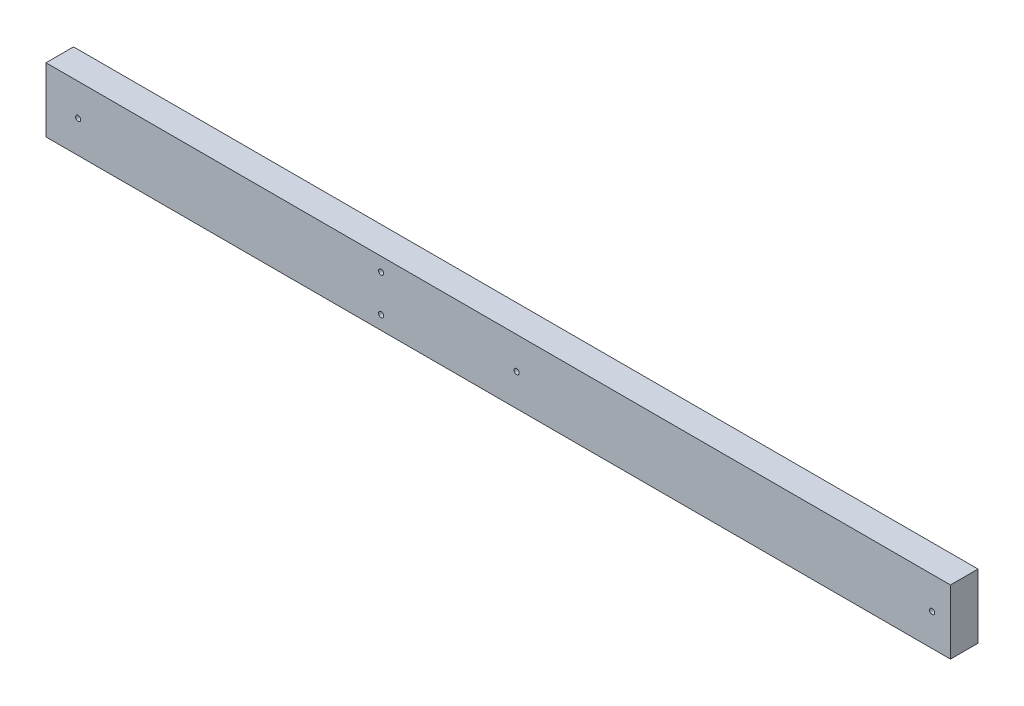
ISO-10303-21;
HEADER;
FILE_DESCRIPTION(('STEP AP214'),'2;1');
FILE_NAME('part.step','',(''),(''),'','','');
FILE_SCHEMA(('AUTOMOTIVE_DESIGN { 1 0 10303 214 1 1 1 1 }'));
ENDSEC;
DATA;
#1=APPLICATION_CONTEXT('core data for automotive mechanical design processes');
#2=APPLICATION_PROTOCOL_DEFINITION('international standard','automotive_design',2000,#1);
#3=PRODUCT_CONTEXT('',#1,'mechanical');
#4=PRODUCT('Part','Part','',(#3));
#5=PRODUCT_RELATED_PRODUCT_CATEGORY('part','',(#4));
#6=PRODUCT_DEFINITION_FORMATION('','',#4);
#7=PRODUCT_DEFINITION_CONTEXT('part definition',#1,'design');
#8=PRODUCT_DEFINITION('design','',#6,#7);
#9=PRODUCT_DEFINITION_SHAPE('','',#8);
#10=(LENGTH_UNIT() NAMED_UNIT(*) SI_UNIT(.MILLI.,.METRE.));
#11=(NAMED_UNIT(*) PLANE_ANGLE_UNIT() SI_UNIT($,.RADIAN.));
#12=(NAMED_UNIT(*) SI_UNIT($,.STERADIAN.) SOLID_ANGLE_UNIT());
#13=UNCERTAINTY_MEASURE_WITH_UNIT(LENGTH_MEASURE(1.E-05),#10,'distance_accuracy_value','');
#14=(GEOMETRIC_REPRESENTATION_CONTEXT(3) GLOBAL_UNCERTAINTY_ASSIGNED_CONTEXT((#13)) GLOBAL_UNIT_ASSIGNED_CONTEXT((#10,
#11,#12)) REPRESENTATION_CONTEXT('',''));
#15=CARTESIAN_POINT('',(0.,0.,0.));
#16=DIRECTION('',(0.,0.,1.));
#17=DIRECTION('',(1.,0.,0.));
#18=AXIS2_PLACEMENT_3D('',#15,#16,#17);
#19=CARTESIAN_POINT('',(1250.95,0.,0.));
#20=DIRECTION('',(0.,0.,-1.));
#21=DIRECTION('',(0.,1.,0.));
#22=AXIS2_PLACEMENT_3D('',#19,#20,#21);
#23=PLANE('',#22);
#24=CARTESIAN_POINT('',(44.45,44.45,0.));
#25=DIRECTION('',(0.,0.,1.));
#26=DIRECTION('',(1.,0.,0.));
#27=AXIS2_PLACEMENT_3D('',#24,#25,#26);
#28=CIRCLE('',#27,3.571875);
#29=CARTESIAN_POINT('',(48.021875,44.45,0.));
#30=VERTEX_POINT('',#29);
#31=EDGE_CURVE('E133',#30,#30,#28,.T.);
#32=ORIENTED_EDGE('',*,*,#31,.F.);
#33=EDGE_LOOP('',(#32));
#34=FACE_BOUND('',#33,.T.);
#35=CARTESIAN_POINT('',(1225.55,44.45,0.));
#36=DIRECTION('',(0.,0.,1.));
#37=DIRECTION('',(1.,0.,0.));
#38=AXIS2_PLACEMENT_3D('',#35,#36,#37);
#39=CIRCLE('',#38,3.57187499999998);
#40=CARTESIAN_POINT('',(1229.121875,44.45,0.));
#41=VERTEX_POINT('',#40);
#42=EDGE_CURVE('E127',#41,#41,#39,.T.);
#43=ORIENTED_EDGE('',*,*,#42,.F.);
#44=EDGE_LOOP('',(#43));
#45=FACE_BOUND('',#44,.T.);
#46=CARTESIAN_POINT('',(650.875,44.45,0.));
#47=DIRECTION('',(0.,0.,1.));
#48=DIRECTION('',(1.,0.,0.));
#49=AXIS2_PLACEMENT_3D('',#46,#47,#48);
#50=CIRCLE('',#49,3.57187499999998);
#51=CARTESIAN_POINT('',(654.446875,44.45,0.));
#52=VERTEX_POINT('',#51);
#53=EDGE_CURVE('E121',#52,#52,#50,.T.);
#54=ORIENTED_EDGE('',*,*,#53,.F.);
#55=EDGE_LOOP('',(#54));
#56=FACE_BOUND('',#55,.T.);
#57=CARTESIAN_POINT('',(463.55,19.05,0.));
#58=DIRECTION('',(0.,0.,1.));
#59=DIRECTION('',(1.,0.,0.));
#60=AXIS2_PLACEMENT_3D('',#57,#58,#59);
#61=CIRCLE('',#60,3.57187499999998);
#62=CARTESIAN_POINT('',(467.121875,19.05,0.));
#63=VERTEX_POINT('',#62);
#64=EDGE_CURVE('E115',#63,#63,#61,.T.);
#65=ORIENTED_EDGE('',*,*,#64,.F.);
#66=EDGE_LOOP('',(#65));
#67=FACE_BOUND('',#66,.T.);
#68=CARTESIAN_POINT('',(463.55,69.85,0.));
#69=DIRECTION('',(0.,0.,1.));
#70=DIRECTION('',(1.,0.,0.));
#71=AXIS2_PLACEMENT_3D('',#68,#69,#70);
#72=CIRCLE('',#71,3.57187499999998);
#73=CARTESIAN_POINT('',(467.121875,69.85,0.));
#74=VERTEX_POINT('',#73);
#75=EDGE_CURVE('E109',#74,#74,#72,.T.);
#76=ORIENTED_EDGE('',*,*,#75,.F.);
#77=EDGE_LOOP('',(#76));
#78=FACE_BOUND('',#77,.T.);
#79=DIRECTION('',(0.,-1.,0.));
#80=VECTOR('',#79,1.);
#81=CARTESIAN_POINT('',(0.,0.,0.));
#82=LINE('',#81,#80);
#83=CARTESIAN_POINT('',(0.,88.9,0.));
#84=VERTEX_POINT('',#83);
#85=CARTESIAN_POINT('',(0.,0.,0.));
#86=VERTEX_POINT('',#85);
#87=EDGE_CURVE('E95',#84,#86,#82,.T.);
#88=ORIENTED_EDGE('',*,*,#87,.T.);
#89=DIRECTION('',(-1.,0.,0.));
#90=VECTOR('',#89,1.);
#91=CARTESIAN_POINT('',(1250.95,0.,0.));
#92=LINE('',#91,#90);
#93=CARTESIAN_POINT('',(1250.95,0.,0.));
#94=VERTEX_POINT('',#93);
#95=EDGE_CURVE('E11',#94,#86,#92,.T.);
#96=ORIENTED_EDGE('',*,*,#95,.F.);
#97=DIRECTION('',(0.,-1.,0.));
#98=VECTOR('',#97,1.);
#99=CARTESIAN_POINT('',(1250.95,0.,0.));
#100=LINE('',#99,#98);
#101=CARTESIAN_POINT('',(1250.95,88.9,0.));
#102=VERTEX_POINT('',#101);
#103=EDGE_CURVE('E83',#102,#94,#100,.T.);
#104=ORIENTED_EDGE('',*,*,#103,.F.);
#105=DIRECTION('',(-1.,0.,0.));
#106=VECTOR('',#105,1.);
#107=CARTESIAN_POINT('',(1250.95,88.9,0.));
#108=LINE('',#107,#106);
#109=EDGE_CURVE('E91',#102,#84,#108,.T.);
#110=ORIENTED_EDGE('',*,*,#109,.T.);
#111=EDGE_LOOP('',(#88,#96,#104,#110));
#112=FACE_BOUND('',#111,.T.);
#113=ADVANCED_FACE('F32',(#34,#45,#56,#67,#78,#112),#23,.F.);
#114=CARTESIAN_POINT('',(1250.95,0.,0.));
#115=DIRECTION('',(0.,1.,0.));
#116=DIRECTION('',(0.,0.,1.));
#117=AXIS2_PLACEMENT_3D('',#114,#115,#116);
#118=PLANE('',#117);
#119=DIRECTION('',(0.,0.,-1.));
#120=VECTOR('',#119,1.);
#121=CARTESIAN_POINT('',(0.,0.,0.));
#122=LINE('',#121,#120);
#123=CARTESIAN_POINT('',(0.,0.,-38.1));
#124=VERTEX_POINT('',#123);
#125=EDGE_CURVE('E87',#86,#124,#122,.T.);
#126=ORIENTED_EDGE('',*,*,#125,.T.);
#127=DIRECTION('',(-1.,0.,0.));
#128=VECTOR('',#127,1.);
#129=CARTESIAN_POINT('',(1250.95,0.,-38.1));
#130=LINE('',#129,#128);
#131=CARTESIAN_POINT('',(1250.95,0.,-38.1));
#132=VERTEX_POINT('',#131);
#133=EDGE_CURVE('E40',#132,#124,#130,.T.);
#134=ORIENTED_EDGE('',*,*,#133,.F.);
#135=DIRECTION('',(0.,0.,-1.));
#136=VECTOR('',#135,1.);
#137=CARTESIAN_POINT('',(1250.95,0.,0.));
#138=LINE('',#137,#136);
#139=EDGE_CURVE('E78',#94,#132,#138,.T.);
#140=ORIENTED_EDGE('',*,*,#139,.F.);
#141=ORIENTED_EDGE('',*,*,#95,.T.);
#142=EDGE_LOOP('',(#126,#134,#140,#141));
#143=FACE_BOUND('',#142,.T.);
#144=ADVANCED_FACE('F86',(#143),#118,.F.);
#145=CARTESIAN_POINT('',(1250.95,0.,-38.1));
#146=DIRECTION('',(0.,0.,1.));
#147=DIRECTION('',(0.,-1.,0.));
#148=AXIS2_PLACEMENT_3D('',#145,#146,#147);
#149=PLANE('',#148);
#150=CARTESIAN_POINT('',(44.45,44.45,-38.1));
#151=DIRECTION('',(0.,0.,1.));
#152=DIRECTION('',(1.,0.,0.));
#153=AXIS2_PLACEMENT_3D('',#150,#151,#152);
#154=CIRCLE('',#153,3.571875);
#155=CARTESIAN_POINT('',(48.021875,44.45,-38.1));
#156=VERTEX_POINT('',#155);
#157=EDGE_CURVE('E98',#156,#156,#154,.T.);
#158=ORIENTED_EDGE('',*,*,#157,.T.);
#159=EDGE_LOOP('',(#158));
#160=FACE_BOUND('',#159,.T.);
#161=CARTESIAN_POINT('',(1225.55,44.45,-38.1));
#162=DIRECTION('',(0.,0.,1.));
#163=DIRECTION('',(1.,0.,0.));
#164=AXIS2_PLACEMENT_3D('',#161,#162,#163);
#165=CIRCLE('',#164,3.57187499999998);
#166=CARTESIAN_POINT('',(1229.121875,44.45,-38.1));
#167=VERTEX_POINT('',#166);
#168=EDGE_CURVE('E130',#167,#167,#165,.T.);
#169=ORIENTED_EDGE('',*,*,#168,.T.);
#170=EDGE_LOOP('',(#169));
#171=FACE_BOUND('',#170,.T.);
#172=CARTESIAN_POINT('',(650.875,44.45,-38.1));
#173=DIRECTION('',(0.,0.,1.));
#174=DIRECTION('',(1.,0.,0.));
#175=AXIS2_PLACEMENT_3D('',#172,#173,#174);
#176=CIRCLE('',#175,3.57187499999998);
#177=CARTESIAN_POINT('',(654.446875,44.45,-38.1));
#178=VERTEX_POINT('',#177);
#179=EDGE_CURVE('E124',#178,#178,#176,.T.);
#180=ORIENTED_EDGE('',*,*,#179,.T.);
#181=EDGE_LOOP('',(#180));
#182=FACE_BOUND('',#181,.T.);
#183=CARTESIAN_POINT('',(463.55,19.05,-38.1));
#184=DIRECTION('',(0.,0.,1.));
#185=DIRECTION('',(1.,0.,0.));
#186=AXIS2_PLACEMENT_3D('',#183,#184,#185);
#187=CIRCLE('',#186,3.57187499999998);
#188=CARTESIAN_POINT('',(467.121875,19.05,-38.1));
#189=VERTEX_POINT('',#188);
#190=EDGE_CURVE('E118',#189,#189,#187,.T.);
#191=ORIENTED_EDGE('',*,*,#190,.T.);
#192=EDGE_LOOP('',(#191));
#193=FACE_BOUND('',#192,.T.);
#194=CARTESIAN_POINT('',(463.55,69.85,-38.1));
#195=DIRECTION('',(0.,0.,1.));
#196=DIRECTION('',(1.,0.,0.));
#197=AXIS2_PLACEMENT_3D('',#194,#195,#196);
#198=CIRCLE('',#197,3.57187499999998);
#199=CARTESIAN_POINT('',(467.121875,69.85,-38.1));
#200=VERTEX_POINT('',#199);
#201=EDGE_CURVE('E112',#200,#200,#198,.T.);
#202=ORIENTED_EDGE('',*,*,#201,.T.);
#203=EDGE_LOOP('',(#202));
#204=FACE_BOUND('',#203,.T.);
#205=DIRECTION('',(0.,1.,0.));
#206=VECTOR('',#205,1.);
#207=CARTESIAN_POINT('',(0.,0.,-38.1));
#208=LINE('',#207,#206);
#209=CARTESIAN_POINT('',(0.,88.9,-38.1));
#210=VERTEX_POINT('',#209);
#211=EDGE_CURVE('E65',#124,#210,#208,.T.);
#212=ORIENTED_EDGE('',*,*,#211,.T.);
#213=DIRECTION('',(-1.,0.,0.));
#214=VECTOR('',#213,1.);
#215=CARTESIAN_POINT('',(1250.95,88.9,-38.1));
#216=LINE('',#215,#214);
#217=CARTESIAN_POINT('',(1250.95,88.9,-38.1));
#218=VERTEX_POINT('',#217);
#219=EDGE_CURVE('E88',#218,#210,#216,.T.);
#220=ORIENTED_EDGE('',*,*,#219,.F.);
#221=DIRECTION('',(0.,1.,0.));
#222=VECTOR('',#221,1.);
#223=CARTESIAN_POINT('',(1250.95,0.,-38.1));
#224=LINE('',#223,#222);
#225=EDGE_CURVE('E81',#132,#218,#224,.T.);
#226=ORIENTED_EDGE('',*,*,#225,.F.);
#227=ORIENTED_EDGE('',*,*,#133,.T.);
#228=EDGE_LOOP('',(#212,#220,#226,#227));
#229=FACE_BOUND('',#228,.T.);
#230=ADVANCED_FACE('F89',(#160,#171,#182,#193,#204,#229),#149,.F.);
#231=CARTESIAN_POINT('',(1250.95,88.9,0.));
#232=DIRECTION('',(0.,-1.,0.));
#233=DIRECTION('',(0.,0.,-1.));
#234=AXIS2_PLACEMENT_3D('',#231,#232,#233);
#235=PLANE('',#234);
#236=DIRECTION('',(0.,0.,1.));
#237=VECTOR('',#236,1.);
#238=CARTESIAN_POINT('',(0.,88.9,0.));
#239=LINE('',#238,#237);
#240=EDGE_CURVE('E71',#210,#84,#239,.T.);
#241=ORIENTED_EDGE('',*,*,#240,.T.);
#242=ORIENTED_EDGE('',*,*,#109,.F.);
#243=DIRECTION('',(0.,0.,1.));
#244=VECTOR('',#243,1.);
#245=CARTESIAN_POINT('',(1250.95,88.9,0.));
#246=LINE('',#245,#244);
#247=EDGE_CURVE('E48',#218,#102,#246,.T.);
#248=ORIENTED_EDGE('',*,*,#247,.F.);
#249=ORIENTED_EDGE('',*,*,#219,.T.);
#250=EDGE_LOOP('',(#241,#242,#248,#249));
#251=FACE_BOUND('',#250,.T.);
#252=ADVANCED_FACE('F103',(#251),#235,.F.);
#253=CARTESIAN_POINT('',(1250.95,0.,0.));
#254=DIRECTION('',(-1.,0.,0.));
#255=DIRECTION('',(0.,0.,1.));
#256=AXIS2_PLACEMENT_3D('',#253,#254,#255);
#257=PLANE('',#256);
#258=ORIENTED_EDGE('',*,*,#103,.T.);
#259=ORIENTED_EDGE('',*,*,#139,.T.);
#260=ORIENTED_EDGE('',*,*,#225,.T.);
#261=ORIENTED_EDGE('',*,*,#247,.T.);
#262=EDGE_LOOP('',(#258,#259,#260,#261));
#263=FACE_BOUND('',#262,.T.);
#264=ADVANCED_FACE('F79',(#263),#257,.F.);
#265=CARTESIAN_POINT('',(0.,0.,0.));
#266=DIRECTION('',(-1.,0.,0.));
#267=DIRECTION('',(0.,0.,1.));
#268=AXIS2_PLACEMENT_3D('',#265,#266,#267);
#269=PLANE('',#268);
#270=ORIENTED_EDGE('',*,*,#87,.F.);
#271=ORIENTED_EDGE('',*,*,#240,.F.);
#272=ORIENTED_EDGE('',*,*,#211,.F.);
#273=ORIENTED_EDGE('',*,*,#125,.F.);
#274=EDGE_LOOP('',(#270,#271,#272,#273));
#275=FACE_BOUND('',#274,.T.);
#276=ADVANCED_FACE('F106',(#275),#269,.T.);
#277=CARTESIAN_POINT('',(463.55,69.85,-38.1));
#278=DIRECTION('',(0.,0.,1.));
#279=DIRECTION('',(1.,0.,0.));
#280=AXIS2_PLACEMENT_3D('',#277,#278,#279);
#281=CYLINDRICAL_SURFACE('',#280,3.57187499999998);
#282=CARTESIAN_POINT('',(467.121875,69.85,-38.1));
#283=CARTESIAN_POINT('',(467.121875,69.85,-37.703125));
#284=CARTESIAN_POINT('',(467.121875,69.85,-37.30625));
#285=CARTESIAN_POINT('',(467.121875,69.85,-36.5125));
#286=CARTESIAN_POINT('',(467.121875,69.85,-36.115625));
#287=CARTESIAN_POINT('',(467.121875,69.85,-35.321875));
#288=CARTESIAN_POINT('',(467.121875,69.85,-34.925));
#289=CARTESIAN_POINT('',(467.121875,69.85,-34.13125));
#290=CARTESIAN_POINT('',(467.121875,69.85,-33.734375));
#291=CARTESIAN_POINT('',(467.121875,69.85,-32.940625));
#292=CARTESIAN_POINT('',(467.121875,69.85,-32.54375));
#293=CARTESIAN_POINT('',(467.121875,69.85,-31.75));
#294=CARTESIAN_POINT('',(467.121875,69.85,-31.353125));
#295=CARTESIAN_POINT('',(467.121875,69.85,-30.559375));
#296=CARTESIAN_POINT('',(467.121875,69.85,-30.1625));
#297=CARTESIAN_POINT('',(467.121875,69.85,-29.36875));
#298=CARTESIAN_POINT('',(467.121875,69.85,-28.971875));
#299=CARTESIAN_POINT('',(467.121875,69.85,-28.178125));
#300=CARTESIAN_POINT('',(467.121875,69.85,-27.78125));
#301=CARTESIAN_POINT('',(467.121875,69.85,-26.9875));
#302=CARTESIAN_POINT('',(467.121875,69.85,-26.590625));
#303=CARTESIAN_POINT('',(467.121875,69.85,-25.796875));
#304=CARTESIAN_POINT('',(467.121875,69.85,-25.4));
#305=CARTESIAN_POINT('',(467.121875,69.85,-24.60625));
#306=CARTESIAN_POINT('',(467.121875,69.85,-24.209375));
#307=CARTESIAN_POINT('',(467.121875,69.85,-23.415625));
#308=CARTESIAN_POINT('',(467.121875,69.85,-23.01875));
#309=CARTESIAN_POINT('',(467.121875,69.85,-22.225));
#310=CARTESIAN_POINT('',(467.121875,69.85,-21.828125));
#311=CARTESIAN_POINT('',(467.121875,69.85,-21.034375));
#312=CARTESIAN_POINT('',(467.121875,69.85,-20.6375));
#313=CARTESIAN_POINT('',(467.121875,69.85,-19.84375));
#314=CARTESIAN_POINT('',(467.121875,69.85,-19.446875));
#315=CARTESIAN_POINT('',(467.121875,69.85,-18.653125));
#316=CARTESIAN_POINT('',(467.121875,69.85,-18.25625));
#317=CARTESIAN_POINT('',(467.121875,69.85,-17.4625));
#318=CARTESIAN_POINT('',(467.121875,69.85,-17.065625));
#319=CARTESIAN_POINT('',(467.121875,69.85,-16.271875));
#320=CARTESIAN_POINT('',(467.121875,69.85,-15.875));
#321=CARTESIAN_POINT('',(467.121875,69.85,-15.08125));
#322=CARTESIAN_POINT('',(467.121875,69.85,-14.684375));
#323=CARTESIAN_POINT('',(467.121875,69.85,-13.890625));
#324=CARTESIAN_POINT('',(467.121875,69.85,-13.49375));
#325=CARTESIAN_POINT('',(467.121875,69.85,-12.7));
#326=CARTESIAN_POINT('',(467.121875,69.85,-12.303125));
#327=CARTESIAN_POINT('',(467.121875,69.85,-11.509375));
#328=CARTESIAN_POINT('',(467.121875,69.85,-11.1125));
#329=CARTESIAN_POINT('',(467.121875,69.85,-10.31875));
#330=CARTESIAN_POINT('',(467.121875,69.85,-9.921875));
#331=CARTESIAN_POINT('',(467.121875,69.85,-9.128125));
#332=CARTESIAN_POINT('',(467.121875,69.85,-8.73125));
#333=CARTESIAN_POINT('',(467.121875,69.85,-7.9375));
#334=CARTESIAN_POINT('',(467.121875,69.85,-7.540625));
#335=CARTESIAN_POINT('',(467.121875,69.85,-6.746875));
#336=CARTESIAN_POINT('',(467.121875,69.85,-6.35));
#337=CARTESIAN_POINT('',(467.121875,69.85,-5.55625));
#338=CARTESIAN_POINT('',(467.121875,69.85,-5.159375));
#339=CARTESIAN_POINT('',(467.121875,69.85,-4.365625));
#340=CARTESIAN_POINT('',(467.121875,69.85,-3.96875));
#341=CARTESIAN_POINT('',(467.121875,69.85,-3.175));
#342=CARTESIAN_POINT('',(467.121875,69.85,-2.778125));
#343=CARTESIAN_POINT('',(467.121875,69.85,-1.984375));
#344=CARTESIAN_POINT('',(467.121875,69.85,-1.5875));
#345=CARTESIAN_POINT('',(467.121875,69.85,-0.79375));
#346=CARTESIAN_POINT('',(467.121875,69.85,-0.396875));
#347=CARTESIAN_POINT('',(467.121875,69.85,0.));
#348=B_SPLINE_CURVE_WITH_KNOTS('',3,(#282,#283,#284,#285,#286,#287,#288,#289,#290,#291,#292,
#293,#294,#295,#296,#297,#298,#299,#300,#301,#302,#303,#304,#305,#306,#307,#308,#309,#310,#311,
#312,#313,#314,#315,#316,#317,#318,#319,#320,#321,#322,#323,#324,#325,#326,#327,#328,#329,#330,
#331,#332,#333,#334,#335,#336,#337,#338,#339,#340,#341,#342,#343,#344,#345,#346,#347),
.UNSPECIFIED.,.F.,.F.,(4,2,2,2,2,2,2,2,2,2,2,2,2,2,2,2,2,2,2,2,2,2,2,2,2,2,2,2,2,2,2,2,4),(0.,
1.19062499999999,2.38124999999999,3.571875,4.7625,5.953125,7.14375,8.334375,9.525,10.715625,
11.90625,13.096875,14.2875,15.478125,16.66875,17.859375,19.05,20.240625,21.43125,22.621875,
23.8125,25.003125,26.19375,27.384375,28.575,29.765625,30.95625,32.146875,33.3375,34.528125,
35.71875,36.909375,38.1),.UNSPECIFIED.);
#349=EDGE_CURVE('BSEAM158',#200,#74,#348,.T.);
#350=ORIENTED_EDGE('',*,*,#201,.F.);
#351=ORIENTED_EDGE('',*,*,#75,.T.);
#352=ORIENTED_EDGE('',*,*,#349,.T.);
#353=ORIENTED_EDGE('',*,*,#349,.F.);
#354=EDGE_LOOP('',(#350,#352,#351,#353));
#355=FACE_BOUND('',#354,.T.);
#356=ADVANCED_FACE('F158',(#355),#281,.F.);
#357=CARTESIAN_POINT('',(463.55,19.05,-38.1));
#358=DIRECTION('',(0.,0.,1.));
#359=DIRECTION('',(1.,0.,0.));
#360=AXIS2_PLACEMENT_3D('',#357,#358,#359);
#361=CYLINDRICAL_SURFACE('',#360,3.57187499999998);
#362=CARTESIAN_POINT('',(467.121875,19.05,-38.1));
#363=CARTESIAN_POINT('',(467.121875,19.05,-37.703125));
#364=CARTESIAN_POINT('',(467.121875,19.05,-37.30625));
#365=CARTESIAN_POINT('',(467.121875,19.05,-36.5125));
#366=CARTESIAN_POINT('',(467.121875,19.05,-36.115625));
#367=CARTESIAN_POINT('',(467.121875,19.05,-35.321875));
#368=CARTESIAN_POINT('',(467.121875,19.05,-34.925));
#369=CARTESIAN_POINT('',(467.121875,19.05,-34.13125));
#370=CARTESIAN_POINT('',(467.121875,19.05,-33.734375));
#371=CARTESIAN_POINT('',(467.121875,19.05,-32.940625));
#372=CARTESIAN_POINT('',(467.121875,19.05,-32.54375));
#373=CARTESIAN_POINT('',(467.121875,19.05,-31.75));
#374=CARTESIAN_POINT('',(467.121875,19.05,-31.353125));
#375=CARTESIAN_POINT('',(467.121875,19.05,-30.559375));
#376=CARTESIAN_POINT('',(467.121875,19.05,-30.1625));
#377=CARTESIAN_POINT('',(467.121875,19.05,-29.36875));
#378=CARTESIAN_POINT('',(467.121875,19.05,-28.971875));
#379=CARTESIAN_POINT('',(467.121875,19.05,-28.178125));
#380=CARTESIAN_POINT('',(467.121875,19.05,-27.78125));
#381=CARTESIAN_POINT('',(467.121875,19.05,-26.9875));
#382=CARTESIAN_POINT('',(467.121875,19.05,-26.590625));
#383=CARTESIAN_POINT('',(467.121875,19.05,-25.796875));
#384=CARTESIAN_POINT('',(467.121875,19.05,-25.4));
#385=CARTESIAN_POINT('',(467.121875,19.05,-24.60625));
#386=CARTESIAN_POINT('',(467.121875,19.05,-24.209375));
#387=CARTESIAN_POINT('',(467.121875,19.05,-23.415625));
#388=CARTESIAN_POINT('',(467.121875,19.05,-23.01875));
#389=CARTESIAN_POINT('',(467.121875,19.05,-22.225));
#390=CARTESIAN_POINT('',(467.121875,19.05,-21.828125));
#391=CARTESIAN_POINT('',(467.121875,19.05,-21.034375));
#392=CARTESIAN_POINT('',(467.121875,19.05,-20.6375));
#393=CARTESIAN_POINT('',(467.121875,19.05,-19.84375));
#394=CARTESIAN_POINT('',(467.121875,19.05,-19.446875));
#395=CARTESIAN_POINT('',(467.121875,19.05,-18.653125));
#396=CARTESIAN_POINT('',(467.121875,19.05,-18.25625));
#397=CARTESIAN_POINT('',(467.121875,19.05,-17.4625));
#398=CARTESIAN_POINT('',(467.121875,19.05,-17.065625));
#399=CARTESIAN_POINT('',(467.121875,19.05,-16.271875));
#400=CARTESIAN_POINT('',(467.121875,19.05,-15.875));
#401=CARTESIAN_POINT('',(467.121875,19.05,-15.08125));
#402=CARTESIAN_POINT('',(467.121875,19.05,-14.684375));
#403=CARTESIAN_POINT('',(467.121875,19.05,-13.890625));
#404=CARTESIAN_POINT('',(467.121875,19.05,-13.49375));
#405=CARTESIAN_POINT('',(467.121875,19.05,-12.7));
#406=CARTESIAN_POINT('',(467.121875,19.05,-12.303125));
#407=CARTESIAN_POINT('',(467.121875,19.05,-11.509375));
#408=CARTESIAN_POINT('',(467.121875,19.05,-11.1125));
#409=CARTESIAN_POINT('',(467.121875,19.05,-10.31875));
#410=CARTESIAN_POINT('',(467.121875,19.05,-9.921875));
#411=CARTESIAN_POINT('',(467.121875,19.05,-9.128125));
#412=CARTESIAN_POINT('',(467.121875,19.05,-8.73125));
#413=CARTESIAN_POINT('',(467.121875,19.05,-7.9375));
#414=CARTESIAN_POINT('',(467.121875,19.05,-7.540625));
#415=CARTESIAN_POINT('',(467.121875,19.05,-6.746875));
#416=CARTESIAN_POINT('',(467.121875,19.05,-6.35));
#417=CARTESIAN_POINT('',(467.121875,19.05,-5.55625));
#418=CARTESIAN_POINT('',(467.121875,19.05,-5.159375));
#419=CARTESIAN_POINT('',(467.121875,19.05,-4.365625));
#420=CARTESIAN_POINT('',(467.121875,19.05,-3.96875));
#421=CARTESIAN_POINT('',(467.121875,19.05,-3.175));
#422=CARTESIAN_POINT('',(467.121875,19.05,-2.778125));
#423=CARTESIAN_POINT('',(467.121875,19.05,-1.984375));
#424=CARTESIAN_POINT('',(467.121875,19.05,-1.5875));
#425=CARTESIAN_POINT('',(467.121875,19.05,-0.79375));
#426=CARTESIAN_POINT('',(467.121875,19.05,-0.396875));
#427=CARTESIAN_POINT('',(467.121875,19.05,0.));
#428=B_SPLINE_CURVE_WITH_KNOTS('',3,(#362,#363,#364,#365,#366,#367,#368,#369,#370,#371,#372,
#373,#374,#375,#376,#377,#378,#379,#380,#381,#382,#383,#384,#385,#386,#387,#388,#389,#390,#391,
#392,#393,#394,#395,#396,#397,#398,#399,#400,#401,#402,#403,#404,#405,#406,#407,#408,#409,#410,
#411,#412,#413,#414,#415,#416,#417,#418,#419,#420,#421,#422,#423,#424,#425,#426,#427),
.UNSPECIFIED.,.F.,.F.,(4,2,2,2,2,2,2,2,2,2,2,2,2,2,2,2,2,2,2,2,2,2,2,2,2,2,2,2,2,2,2,2,4),(0.,
1.19062499999999,2.38124999999999,3.571875,4.7625,5.953125,7.14375,8.334375,9.525,10.715625,
11.90625,13.096875,14.2875,15.478125,16.66875,17.859375,19.05,20.240625,21.43125,22.621875,
23.8125,25.003125,26.19375,27.384375,28.575,29.765625,30.95625,32.146875,33.3375,34.528125,
35.71875,36.909375,38.1),.UNSPECIFIED.);
#429=EDGE_CURVE('BSEAM160',#189,#63,#428,.T.);
#430=ORIENTED_EDGE('',*,*,#190,.F.);
#431=ORIENTED_EDGE('',*,*,#64,.T.);
#432=ORIENTED_EDGE('',*,*,#429,.T.);
#433=ORIENTED_EDGE('',*,*,#429,.F.);
#434=EDGE_LOOP('',(#430,#432,#431,#433));
#435=FACE_BOUND('',#434,.T.);
#436=ADVANCED_FACE('F160',(#435),#361,.F.);
#437=CARTESIAN_POINT('',(650.875,44.45,-38.1));
#438=DIRECTION('',(0.,0.,1.));
#439=DIRECTION('',(1.,0.,0.));
#440=AXIS2_PLACEMENT_3D('',#437,#438,#439);
#441=CYLINDRICAL_SURFACE('',#440,3.57187499999998);
#442=CARTESIAN_POINT('',(654.446875,44.45,-38.1));
#443=CARTESIAN_POINT('',(654.446875,44.45,-37.703125));
#444=CARTESIAN_POINT('',(654.446875,44.45,-37.30625));
#445=CARTESIAN_POINT('',(654.446875,44.45,-36.5125));
#446=CARTESIAN_POINT('',(654.446875,44.45,-36.115625));
#447=CARTESIAN_POINT('',(654.446875,44.45,-35.321875));
#448=CARTESIAN_POINT('',(654.446875,44.45,-34.925));
#449=CARTESIAN_POINT('',(654.446875,44.45,-34.13125));
#450=CARTESIAN_POINT('',(654.446875,44.45,-33.734375));
#451=CARTESIAN_POINT('',(654.446875,44.45,-32.940625));
#452=CARTESIAN_POINT('',(654.446875,44.45,-32.54375));
#453=CARTESIAN_POINT('',(654.446875,44.45,-31.75));
#454=CARTESIAN_POINT('',(654.446875,44.45,-31.353125));
#455=CARTESIAN_POINT('',(654.446875,44.45,-30.559375));
#456=CARTESIAN_POINT('',(654.446875,44.45,-30.1625));
#457=CARTESIAN_POINT('',(654.446875,44.45,-29.36875));
#458=CARTESIAN_POINT('',(654.446875,44.45,-28.971875));
#459=CARTESIAN_POINT('',(654.446875,44.45,-28.178125));
#460=CARTESIAN_POINT('',(654.446875,44.45,-27.78125));
#461=CARTESIAN_POINT('',(654.446875,44.45,-26.9875));
#462=CARTESIAN_POINT('',(654.446875,44.45,-26.590625));
#463=CARTESIAN_POINT('',(654.446875,44.45,-25.796875));
#464=CARTESIAN_POINT('',(654.446875,44.45,-25.4));
#465=CARTESIAN_POINT('',(654.446875,44.45,-24.60625));
#466=CARTESIAN_POINT('',(654.446875,44.45,-24.209375));
#467=CARTESIAN_POINT('',(654.446875,44.45,-23.415625));
#468=CARTESIAN_POINT('',(654.446875,44.45,-23.01875));
#469=CARTESIAN_POINT('',(654.446875,44.45,-22.225));
#470=CARTESIAN_POINT('',(654.446875,44.45,-21.828125));
#471=CARTESIAN_POINT('',(654.446875,44.45,-21.034375));
#472=CARTESIAN_POINT('',(654.446875,44.45,-20.6375));
#473=CARTESIAN_POINT('',(654.446875,44.45,-19.84375));
#474=CARTESIAN_POINT('',(654.446875,44.45,-19.446875));
#475=CARTESIAN_POINT('',(654.446875,44.45,-18.653125));
#476=CARTESIAN_POINT('',(654.446875,44.45,-18.25625));
#477=CARTESIAN_POINT('',(654.446875,44.45,-17.4625));
#478=CARTESIAN_POINT('',(654.446875,44.45,-17.065625));
#479=CARTESIAN_POINT('',(654.446875,44.45,-16.271875));
#480=CARTESIAN_POINT('',(654.446875,44.45,-15.875));
#481=CARTESIAN_POINT('',(654.446875,44.45,-15.08125));
#482=CARTESIAN_POINT('',(654.446875,44.45,-14.684375));
#483=CARTESIAN_POINT('',(654.446875,44.45,-13.890625));
#484=CARTESIAN_POINT('',(654.446875,44.45,-13.49375));
#485=CARTESIAN_POINT('',(654.446875,44.45,-12.7));
#486=CARTESIAN_POINT('',(654.446875,44.45,-12.303125));
#487=CARTESIAN_POINT('',(654.446875,44.45,-11.509375));
#488=CARTESIAN_POINT('',(654.446875,44.45,-11.1125));
#489=CARTESIAN_POINT('',(654.446875,44.45,-10.31875));
#490=CARTESIAN_POINT('',(654.446875,44.45,-9.921875));
#491=CARTESIAN_POINT('',(654.446875,44.45,-9.128125));
#492=CARTESIAN_POINT('',(654.446875,44.45,-8.73125));
#493=CARTESIAN_POINT('',(654.446875,44.45,-7.9375));
#494=CARTESIAN_POINT('',(654.446875,44.45,-7.540625));
#495=CARTESIAN_POINT('',(654.446875,44.45,-6.746875));
#496=CARTESIAN_POINT('',(654.446875,44.45,-6.35));
#497=CARTESIAN_POINT('',(654.446875,44.45,-5.55625));
#498=CARTESIAN_POINT('',(654.446875,44.45,-5.159375));
#499=CARTESIAN_POINT('',(654.446875,44.45,-4.365625));
#500=CARTESIAN_POINT('',(654.446875,44.45,-3.96875));
#501=CARTESIAN_POINT('',(654.446875,44.45,-3.175));
#502=CARTESIAN_POINT('',(654.446875,44.45,-2.778125));
#503=CARTESIAN_POINT('',(654.446875,44.45,-1.984375));
#504=CARTESIAN_POINT('',(654.446875,44.45,-1.5875));
#505=CARTESIAN_POINT('',(654.446875,44.45,-0.79375));
#506=CARTESIAN_POINT('',(654.446875,44.45,-0.396875));
#507=CARTESIAN_POINT('',(654.446875,44.45,0.));
#508=B_SPLINE_CURVE_WITH_KNOTS('',3,(#442,#443,#444,#445,#446,#447,#448,#449,#450,#451,#452,
#453,#454,#455,#456,#457,#458,#459,#460,#461,#462,#463,#464,#465,#466,#467,#468,#469,#470,#471,
#472,#473,#474,#475,#476,#477,#478,#479,#480,#481,#482,#483,#484,#485,#486,#487,#488,#489,#490,
#491,#492,#493,#494,#495,#496,#497,#498,#499,#500,#501,#502,#503,#504,#505,#506,#507),
.UNSPECIFIED.,.F.,.F.,(4,2,2,2,2,2,2,2,2,2,2,2,2,2,2,2,2,2,2,2,2,2,2,2,2,2,2,2,2,2,2,2,4),(0.,
1.19062499999999,2.38124999999999,3.571875,4.7625,5.953125,7.14375,8.334375,9.525,10.715625,
11.90625,13.096875,14.2875,15.478125,16.66875,17.859375,19.05,20.240625,21.43125,22.621875,
23.8125,25.003125,26.19375,27.384375,28.575,29.765625,30.95625,32.146875,33.3375,34.528125,
35.71875,36.909375,38.1),.UNSPECIFIED.);
#509=EDGE_CURVE('BSEAM167',#178,#52,#508,.T.);
#510=ORIENTED_EDGE('',*,*,#179,.F.);
#511=ORIENTED_EDGE('',*,*,#53,.T.);
#512=ORIENTED_EDGE('',*,*,#509,.T.);
#513=ORIENTED_EDGE('',*,*,#509,.F.);
#514=EDGE_LOOP('',(#510,#512,#511,#513));
#515=FACE_BOUND('',#514,.T.);
#516=ADVANCED_FACE('F167',(#515),#441,.F.);
#517=CARTESIAN_POINT('',(1225.55,44.45,-38.1));
#518=DIRECTION('',(0.,0.,1.));
#519=DIRECTION('',(1.,0.,0.));
#520=AXIS2_PLACEMENT_3D('',#517,#518,#519);
#521=CYLINDRICAL_SURFACE('',#520,3.57187499999998);
#522=CARTESIAN_POINT('',(1229.121875,44.45,-38.1));
#523=CARTESIAN_POINT('',(1229.121875,44.45,-37.703125));
#524=CARTESIAN_POINT('',(1229.121875,44.45,-37.30625));
#525=CARTESIAN_POINT('',(1229.121875,44.45,-36.5125));
#526=CARTESIAN_POINT('',(1229.121875,44.45,-36.115625));
#527=CARTESIAN_POINT('',(1229.121875,44.45,-35.321875));
#528=CARTESIAN_POINT('',(1229.121875,44.45,-34.925));
#529=CARTESIAN_POINT('',(1229.121875,44.45,-34.13125));
#530=CARTESIAN_POINT('',(1229.121875,44.45,-33.734375));
#531=CARTESIAN_POINT('',(1229.121875,44.45,-32.940625));
#532=CARTESIAN_POINT('',(1229.121875,44.45,-32.54375));
#533=CARTESIAN_POINT('',(1229.121875,44.45,-31.75));
#534=CARTESIAN_POINT('',(1229.121875,44.45,-31.353125));
#535=CARTESIAN_POINT('',(1229.121875,44.45,-30.559375));
#536=CARTESIAN_POINT('',(1229.121875,44.45,-30.1625));
#537=CARTESIAN_POINT('',(1229.121875,44.45,-29.36875));
#538=CARTESIAN_POINT('',(1229.121875,44.45,-28.971875));
#539=CARTESIAN_POINT('',(1229.121875,44.45,-28.178125));
#540=CARTESIAN_POINT('',(1229.121875,44.45,-27.78125));
#541=CARTESIAN_POINT('',(1229.121875,44.45,-26.9875));
#542=CARTESIAN_POINT('',(1229.121875,44.45,-26.590625));
#543=CARTESIAN_POINT('',(1229.121875,44.45,-25.796875));
#544=CARTESIAN_POINT('',(1229.121875,44.45,-25.4));
#545=CARTESIAN_POINT('',(1229.121875,44.45,-24.60625));
#546=CARTESIAN_POINT('',(1229.121875,44.45,-24.209375));
#547=CARTESIAN_POINT('',(1229.121875,44.45,-23.415625));
#548=CARTESIAN_POINT('',(1229.121875,44.45,-23.01875));
#549=CARTESIAN_POINT('',(1229.121875,44.45,-22.225));
#550=CARTESIAN_POINT('',(1229.121875,44.45,-21.828125));
#551=CARTESIAN_POINT('',(1229.121875,44.45,-21.034375));
#552=CARTESIAN_POINT('',(1229.121875,44.45,-20.6375));
#553=CARTESIAN_POINT('',(1229.121875,44.45,-19.84375));
#554=CARTESIAN_POINT('',(1229.121875,44.45,-19.446875));
#555=CARTESIAN_POINT('',(1229.121875,44.45,-18.653125));
#556=CARTESIAN_POINT('',(1229.121875,44.45,-18.25625));
#557=CARTESIAN_POINT('',(1229.121875,44.45,-17.4625));
#558=CARTESIAN_POINT('',(1229.121875,44.45,-17.065625));
#559=CARTESIAN_POINT('',(1229.121875,44.45,-16.271875));
#560=CARTESIAN_POINT('',(1229.121875,44.45,-15.875));
#561=CARTESIAN_POINT('',(1229.121875,44.45,-15.08125));
#562=CARTESIAN_POINT('',(1229.121875,44.45,-14.684375));
#563=CARTESIAN_POINT('',(1229.121875,44.45,-13.890625));
#564=CARTESIAN_POINT('',(1229.121875,44.45,-13.49375));
#565=CARTESIAN_POINT('',(1229.121875,44.45,-12.7));
#566=CARTESIAN_POINT('',(1229.121875,44.45,-12.303125));
#567=CARTESIAN_POINT('',(1229.121875,44.45,-11.509375));
#568=CARTESIAN_POINT('',(1229.121875,44.45,-11.1125));
#569=CARTESIAN_POINT('',(1229.121875,44.45,-10.31875));
#570=CARTESIAN_POINT('',(1229.121875,44.45,-9.921875));
#571=CARTESIAN_POINT('',(1229.121875,44.45,-9.128125));
#572=CARTESIAN_POINT('',(1229.121875,44.45,-8.73125));
#573=CARTESIAN_POINT('',(1229.121875,44.45,-7.9375));
#574=CARTESIAN_POINT('',(1229.121875,44.45,-7.540625));
#575=CARTESIAN_POINT('',(1229.121875,44.45,-6.746875));
#576=CARTESIAN_POINT('',(1229.121875,44.45,-6.35));
#577=CARTESIAN_POINT('',(1229.121875,44.45,-5.55625));
#578=CARTESIAN_POINT('',(1229.121875,44.45,-5.159375));
#579=CARTESIAN_POINT('',(1229.121875,44.45,-4.365625));
#580=CARTESIAN_POINT('',(1229.121875,44.45,-3.96875));
#581=CARTESIAN_POINT('',(1229.121875,44.45,-3.175));
#582=CARTESIAN_POINT('',(1229.121875,44.45,-2.778125));
#583=CARTESIAN_POINT('',(1229.121875,44.45,-1.984375));
#584=CARTESIAN_POINT('',(1229.121875,44.45,-1.5875));
#585=CARTESIAN_POINT('',(1229.121875,44.45,-0.79375));
#586=CARTESIAN_POINT('',(1229.121875,44.45,-0.396875));
#587=CARTESIAN_POINT('',(1229.121875,44.45,0.));
#588=B_SPLINE_CURVE_WITH_KNOTS('',3,(#522,#523,#524,#525,#526,#527,#528,#529,#530,#531,#532,
#533,#534,#535,#536,#537,#538,#539,#540,#541,#542,#543,#544,#545,#546,#547,#548,#549,#550,#551,
#552,#553,#554,#555,#556,#557,#558,#559,#560,#561,#562,#563,#564,#565,#566,#567,#568,#569,#570,
#571,#572,#573,#574,#575,#576,#577,#578,#579,#580,#581,#582,#583,#584,#585,#586,#587),
.UNSPECIFIED.,.F.,.F.,(4,2,2,2,2,2,2,2,2,2,2,2,2,2,2,2,2,2,2,2,2,2,2,2,2,2,2,2,2,2,2,2,4),(0.,
1.19062499999999,2.38124999999999,3.571875,4.7625,5.953125,7.14375,8.334375,9.525,10.715625,
11.90625,13.096875,14.2875,15.478125,16.66875,17.859375,19.05,20.240625,21.43125,22.621875,
23.8125,25.003125,26.19375,27.384375,28.575,29.765625,30.95625,32.146875,33.3375,34.528125,
35.71875,36.909375,38.1),.UNSPECIFIED.);
#589=EDGE_CURVE('BSEAM144',#167,#41,#588,.T.);
#590=ORIENTED_EDGE('',*,*,#168,.F.);
#591=ORIENTED_EDGE('',*,*,#42,.T.);
#592=ORIENTED_EDGE('',*,*,#589,.T.);
#593=ORIENTED_EDGE('',*,*,#589,.F.);
#594=EDGE_LOOP('',(#590,#592,#591,#593));
#595=FACE_BOUND('',#594,.T.);
#596=ADVANCED_FACE('F144',(#595),#521,.F.);
#597=CARTESIAN_POINT('',(44.45,44.45,-38.1));
#598=DIRECTION('',(0.,0.,1.));
#599=DIRECTION('',(1.,0.,0.));
#600=AXIS2_PLACEMENT_3D('',#597,#598,#599);
#601=CYLINDRICAL_SURFACE('',#600,3.571875);
#602=CARTESIAN_POINT('',(48.021875,44.45,-38.1));
#603=CARTESIAN_POINT('',(48.021875,44.45,-37.703125));
#604=CARTESIAN_POINT('',(48.021875,44.45,-37.30625));
#605=CARTESIAN_POINT('',(48.021875,44.45,-36.5125));
#606=CARTESIAN_POINT('',(48.021875,44.45,-36.115625));
#607=CARTESIAN_POINT('',(48.021875,44.45,-35.321875));
#608=CARTESIAN_POINT('',(48.021875,44.45,-34.925));
#609=CARTESIAN_POINT('',(48.021875,44.45,-34.13125));
#610=CARTESIAN_POINT('',(48.021875,44.45,-33.734375));
#611=CARTESIAN_POINT('',(48.021875,44.45,-32.940625));
#612=CARTESIAN_POINT('',(48.021875,44.45,-32.54375));
#613=CARTESIAN_POINT('',(48.021875,44.45,-31.75));
#614=CARTESIAN_POINT('',(48.021875,44.45,-31.353125));
#615=CARTESIAN_POINT('',(48.021875,44.45,-30.559375));
#616=CARTESIAN_POINT('',(48.021875,44.45,-30.1625));
#617=CARTESIAN_POINT('',(48.021875,44.45,-29.36875));
#618=CARTESIAN_POINT('',(48.021875,44.45,-28.971875));
#619=CARTESIAN_POINT('',(48.021875,44.45,-28.178125));
#620=CARTESIAN_POINT('',(48.021875,44.45,-27.78125));
#621=CARTESIAN_POINT('',(48.021875,44.45,-26.9875));
#622=CARTESIAN_POINT('',(48.021875,44.45,-26.590625));
#623=CARTESIAN_POINT('',(48.021875,44.45,-25.796875));
#624=CARTESIAN_POINT('',(48.021875,44.45,-25.4));
#625=CARTESIAN_POINT('',(48.021875,44.45,-24.60625));
#626=CARTESIAN_POINT('',(48.021875,44.45,-24.209375));
#627=CARTESIAN_POINT('',(48.021875,44.45,-23.415625));
#628=CARTESIAN_POINT('',(48.021875,44.45,-23.01875));
#629=CARTESIAN_POINT('',(48.021875,44.45,-22.225));
#630=CARTESIAN_POINT('',(48.021875,44.45,-21.828125));
#631=CARTESIAN_POINT('',(48.021875,44.45,-21.034375));
#632=CARTESIAN_POINT('',(48.021875,44.45,-20.6375));
#633=CARTESIAN_POINT('',(48.021875,44.45,-19.84375));
#634=CARTESIAN_POINT('',(48.021875,44.45,-19.446875));
#635=CARTESIAN_POINT('',(48.021875,44.45,-18.653125));
#636=CARTESIAN_POINT('',(48.021875,44.45,-18.25625));
#637=CARTESIAN_POINT('',(48.021875,44.45,-17.4625));
#638=CARTESIAN_POINT('',(48.021875,44.45,-17.065625));
#639=CARTESIAN_POINT('',(48.021875,44.45,-16.271875));
#640=CARTESIAN_POINT('',(48.021875,44.45,-15.875));
#641=CARTESIAN_POINT('',(48.021875,44.45,-15.08125));
#642=CARTESIAN_POINT('',(48.021875,44.45,-14.684375));
#643=CARTESIAN_POINT('',(48.021875,44.45,-13.890625));
#644=CARTESIAN_POINT('',(48.021875,44.45,-13.49375));
#645=CARTESIAN_POINT('',(48.021875,44.45,-12.7));
#646=CARTESIAN_POINT('',(48.021875,44.45,-12.303125));
#647=CARTESIAN_POINT('',(48.021875,44.45,-11.509375));
#648=CARTESIAN_POINT('',(48.021875,44.45,-11.1125));
#649=CARTESIAN_POINT('',(48.021875,44.45,-10.31875));
#650=CARTESIAN_POINT('',(48.021875,44.45,-9.921875));
#651=CARTESIAN_POINT('',(48.021875,44.45,-9.128125));
#652=CARTESIAN_POINT('',(48.021875,44.45,-8.73125));
#653=CARTESIAN_POINT('',(48.021875,44.45,-7.9375));
#654=CARTESIAN_POINT('',(48.021875,44.45,-7.540625));
#655=CARTESIAN_POINT('',(48.021875,44.45,-6.746875));
#656=CARTESIAN_POINT('',(48.021875,44.45,-6.35));
#657=CARTESIAN_POINT('',(48.021875,44.45,-5.55625));
#658=CARTESIAN_POINT('',(48.021875,44.45,-5.159375));
#659=CARTESIAN_POINT('',(48.021875,44.45,-4.365625));
#660=CARTESIAN_POINT('',(48.021875,44.45,-3.96875));
#661=CARTESIAN_POINT('',(48.021875,44.45,-3.175));
#662=CARTESIAN_POINT('',(48.021875,44.45,-2.778125));
#663=CARTESIAN_POINT('',(48.021875,44.45,-1.984375));
#664=CARTESIAN_POINT('',(48.021875,44.45,-1.5875));
#665=CARTESIAN_POINT('',(48.021875,44.45,-0.79375));
#666=CARTESIAN_POINT('',(48.021875,44.45,-0.396875));
#667=CARTESIAN_POINT('',(48.021875,44.45,0.));
#668=B_SPLINE_CURVE_WITH_KNOTS('',3,(#602,#603,#604,#605,#606,#607,#608,#609,#610,#611,#612,
#613,#614,#615,#616,#617,#618,#619,#620,#621,#622,#623,#624,#625,#626,#627,#628,#629,#630,#631,
#632,#633,#634,#635,#636,#637,#638,#639,#640,#641,#642,#643,#644,#645,#646,#647,#648,#649,#650,
#651,#652,#653,#654,#655,#656,#657,#658,#659,#660,#661,#662,#663,#664,#665,#666,#667),
.UNSPECIFIED.,.F.,.F.,(4,2,2,2,2,2,2,2,2,2,2,2,2,2,2,2,2,2,2,2,2,2,2,2,2,2,2,2,2,2,2,2,4),(0.,
1.19062499999999,2.38124999999999,3.571875,4.7625,5.953125,7.14375,8.334375,9.525,10.715625,
11.90625,13.096875,14.2875,15.478125,16.66875,17.859375,19.05,20.240625,21.43125,22.621875,
23.8125,25.003125,26.19375,27.384375,28.575,29.765625,30.95625,32.146875,33.3375,34.528125,
35.71875,36.909375,38.1),.UNSPECIFIED.);
#669=EDGE_CURVE('BSEAM141',#156,#30,#668,.T.);
#670=ORIENTED_EDGE('',*,*,#157,.F.);
#671=ORIENTED_EDGE('',*,*,#31,.T.);
#672=ORIENTED_EDGE('',*,*,#669,.T.);
#673=ORIENTED_EDGE('',*,*,#669,.F.);
#674=EDGE_LOOP('',(#670,#672,#671,#673));
#675=FACE_BOUND('',#674,.T.);
#676=ADVANCED_FACE('F141',(#675),#601,.F.);
#677=CLOSED_SHELL('',(#113,#144,#230,#252,#264,#276,#356,#436,#516,#596,#676));
#678=MANIFOLD_SOLID_BREP('B2',#677);
#679=ADVANCED_BREP_SHAPE_REPRESENTATION('',(#18,#678),#14);
#680=SHAPE_DEFINITION_REPRESENTATION(#9,#679);
ENDSEC;
END-ISO-10303-21;
